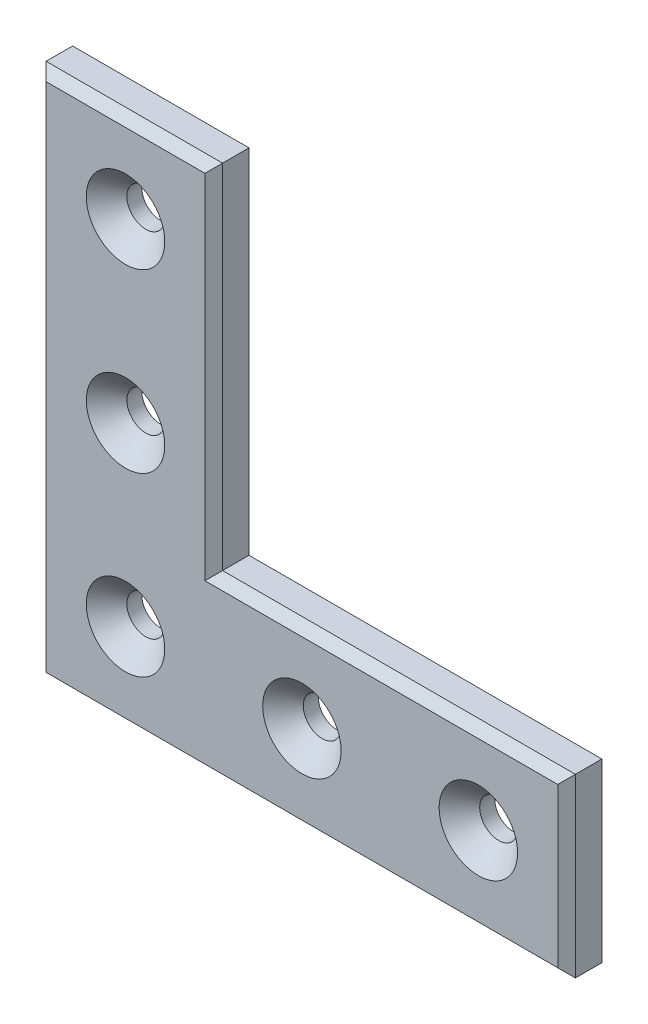
ISO-10303-21;
HEADER;
FILE_DESCRIPTION(('STEP AP214'),'2;1');
FILE_NAME('part.step','',(''),(''),'','','');
FILE_SCHEMA(('AUTOMOTIVE_DESIGN { 1 0 10303 214 1 1 1 1 }'));
ENDSEC;
DATA;
#1=APPLICATION_CONTEXT('core data for automotive mechanical design processes');
#2=APPLICATION_PROTOCOL_DEFINITION('international standard','automotive_design',2000,#1);
#3=PRODUCT_CONTEXT('',#1,'mechanical');
#4=PRODUCT('Part','Part','',(#3));
#5=PRODUCT_RELATED_PRODUCT_CATEGORY('part','',(#4));
#6=PRODUCT_DEFINITION_FORMATION('','',#4);
#7=PRODUCT_DEFINITION_CONTEXT('part definition',#1,'design');
#8=PRODUCT_DEFINITION('design','',#6,#7);
#9=PRODUCT_DEFINITION_SHAPE('','',#8);
#10=(LENGTH_UNIT() NAMED_UNIT(*) SI_UNIT(.MILLI.,.METRE.));
#11=(NAMED_UNIT(*) PLANE_ANGLE_UNIT() SI_UNIT($,.RADIAN.));
#12=(NAMED_UNIT(*) SI_UNIT($,.STERADIAN.) SOLID_ANGLE_UNIT());
#13=UNCERTAINTY_MEASURE_WITH_UNIT(LENGTH_MEASURE(1.E-05),#10,'distance_accuracy_value','');
#14=(GEOMETRIC_REPRESENTATION_CONTEXT(3) GLOBAL_UNCERTAINTY_ASSIGNED_CONTEXT((#13)) GLOBAL_UNIT_ASSIGNED_CONTEXT((#10,
#11,#12)) REPRESENTATION_CONTEXT('',''));
#15=CARTESIAN_POINT('',(0.,0.,0.));
#16=DIRECTION('',(0.,0.,1.));
#17=DIRECTION('',(1.,0.,0.));
#18=AXIS2_PLACEMENT_3D('',#15,#16,#17);
#19=CARTESIAN_POINT('',(0.,0.,4.));
#20=DIRECTION('',(0.,0.,-1.));
#21=DIRECTION('',(-1.,0.,0.));
#22=AXIS2_PLACEMENT_3D('',#19,#20,#21);
#23=PLANE('',#22);
#24=CARTESIAN_POINT('',(20.,0.,4.));
#25=DIRECTION('',(0.,0.,-1.));
#26=DIRECTION('',(-1.,0.,0.));
#27=AXIS2_PLACEMENT_3D('',#24,#25,#26);
#28=CIRCLE('',#27,4.45000000000002);
#29=CARTESIAN_POINT('',(15.55,0.,4.));
#30=VERTEX_POINT('',#29);
#31=EDGE_CURVE('E212',#30,#30,#28,.T.);
#32=ORIENTED_EDGE('',*,*,#31,.T.);
#33=EDGE_LOOP('',(#32));
#34=FACE_BOUND('',#33,.T.);
#35=CARTESIAN_POINT('',(40.,0.,4.));
#36=DIRECTION('',(0.,0.,-1.));
#37=DIRECTION('',(-1.,0.,0.));
#38=AXIS2_PLACEMENT_3D('',#35,#36,#37);
#39=CIRCLE('',#38,4.45000000000002);
#40=CARTESIAN_POINT('',(35.55,0.,4.));
#41=VERTEX_POINT('',#40);
#42=EDGE_CURVE('E209',#41,#41,#39,.T.);
#43=ORIENTED_EDGE('',*,*,#42,.T.);
#44=EDGE_LOOP('',(#43));
#45=FACE_BOUND('',#44,.T.);
#46=CARTESIAN_POINT('',(0.,0.,4.));
#47=DIRECTION('',(0.,0.,-1.));
#48=DIRECTION('',(-1.,0.,0.));
#49=AXIS2_PLACEMENT_3D('',#46,#47,#48);
#50=CIRCLE('',#49,4.45000000000003);
#51=CARTESIAN_POINT('',(-4.45000000000003,0.,4.));
#52=VERTEX_POINT('',#51);
#53=EDGE_CURVE('E206',#52,#52,#50,.T.);
#54=ORIENTED_EDGE('',*,*,#53,.T.);
#55=EDGE_LOOP('',(#54));
#56=FACE_BOUND('',#55,.T.);
#57=CARTESIAN_POINT('',(0.,20.,4.));
#58=DIRECTION('',(0.,0.,-1.));
#59=DIRECTION('',(-1.,0.,0.));
#60=AXIS2_PLACEMENT_3D('',#57,#58,#59);
#61=CIRCLE('',#60,4.45000000000002);
#62=CARTESIAN_POINT('',(-4.45000000000002,20.,4.));
#63=VERTEX_POINT('',#62);
#64=EDGE_CURVE('E203',#63,#63,#61,.T.);
#65=ORIENTED_EDGE('',*,*,#64,.T.);
#66=EDGE_LOOP('',(#65));
#67=FACE_BOUND('',#66,.T.);
#68=CARTESIAN_POINT('',(0.,40.,4.));
#69=DIRECTION('',(0.,0.,-1.));
#70=DIRECTION('',(-1.,0.,0.));
#71=AXIS2_PLACEMENT_3D('',#68,#69,#70);
#72=CIRCLE('',#71,4.45000000000002);
#73=CARTESIAN_POINT('',(-4.45000000000002,40.,4.));
#74=VERTEX_POINT('',#73);
#75=EDGE_CURVE('E200',#74,#74,#72,.T.);
#76=ORIENTED_EDGE('',*,*,#75,.T.);
#77=EDGE_LOOP('',(#76));
#78=FACE_BOUND('',#77,.T.);
#79=DIRECTION('',(1.,0.,0.));
#80=VECTOR('',#79,1.);
#81=CARTESIAN_POINT('',(0.,-9.00000000000001,4.));
#82=LINE('',#81,#80);
#83=CARTESIAN_POINT('',(-9.00000000000001,-9.00000000000001,4.));
#84=VERTEX_POINT('',#83);
#85=CARTESIAN_POINT('',(49.,-9.00000000000001,4.));
#86=VERTEX_POINT('',#85);
#87=EDGE_CURVE('E164',#84,#86,#82,.T.);
#88=ORIENTED_EDGE('',*,*,#87,.T.);
#89=DIRECTION('',(0.,1.,0.));
#90=VECTOR('',#89,1.);
#91=CARTESIAN_POINT('',(49.,0.,4.));
#92=LINE('',#91,#90);
#93=CARTESIAN_POINT('',(49.,9.00000000000001,4.));
#94=VERTEX_POINT('',#93);
#95=EDGE_CURVE('E166',#86,#94,#92,.T.);
#96=ORIENTED_EDGE('',*,*,#95,.T.);
#97=DIRECTION('',(-1.,0.,0.));
#98=VECTOR('',#97,1.);
#99=CARTESIAN_POINT('',(0.,9.00000000000002,4.));
#100=LINE('',#99,#98);
#101=CARTESIAN_POINT('',(9.00000000000002,9.00000000000002,4.));
#102=VERTEX_POINT('',#101);
#103=EDGE_CURVE('E116',#94,#102,#100,.T.);
#104=ORIENTED_EDGE('',*,*,#103,.T.);
#105=DIRECTION('',(0.,1.,0.));
#106=VECTOR('',#105,1.);
#107=CARTESIAN_POINT('',(9.00000000000002,0.,4.));
#108=LINE('',#107,#106);
#109=CARTESIAN_POINT('',(9.00000000000001,49.,4.));
#110=VERTEX_POINT('',#109);
#111=EDGE_CURVE('E158',#102,#110,#108,.T.);
#112=ORIENTED_EDGE('',*,*,#111,.T.);
#113=DIRECTION('',(-1.,0.,0.));
#114=VECTOR('',#113,1.);
#115=CARTESIAN_POINT('',(0.,49.,4.));
#116=LINE('',#115,#114);
#117=CARTESIAN_POINT('',(-9.00000000000001,49.,4.));
#118=VERTEX_POINT('',#117);
#119=EDGE_CURVE('E160',#110,#118,#116,.T.);
#120=ORIENTED_EDGE('',*,*,#119,.T.);
#121=DIRECTION('',(0.,-1.,0.));
#122=VECTOR('',#121,1.);
#123=CARTESIAN_POINT('',(-9.00000000000001,0.,4.));
#124=LINE('',#123,#122);
#125=EDGE_CURVE('E162',#118,#84,#124,.T.);
#126=ORIENTED_EDGE('',*,*,#125,.T.);
#127=EDGE_LOOP('',(#88,#96,#104,#112,#120,#126));
#128=FACE_BOUND('',#127,.T.);
#129=ADVANCED_FACE('F37',(#34,#45,#56,#67,#78,#128),#23,.F.);
#130=CARTESIAN_POINT('',(0.,0.,0.));
#131=DIRECTION('',(0.,0.,-1.));
#132=DIRECTION('',(-1.,0.,0.));
#133=AXIS2_PLACEMENT_3D('',#130,#131,#132);
#134=PLANE('',#133);
#135=CARTESIAN_POINT('',(0.,0.,0.));
#136=DIRECTION('',(0.,0.,1.));
#137=DIRECTION('',(1.,0.,0.));
#138=AXIS2_PLACEMENT_3D('',#135,#136,#137);
#139=CIRCLE('',#138,2.15);
#140=CARTESIAN_POINT('',(2.15,0.,0.));
#141=VERTEX_POINT('',#140);
#142=EDGE_CURVE('E347',#141,#141,#139,.T.);
#143=ORIENTED_EDGE('',*,*,#142,.T.);
#144=EDGE_LOOP('',(#143));
#145=FACE_BOUND('',#144,.T.);
#146=CARTESIAN_POINT('',(0.,20.,0.));
#147=DIRECTION('',(0.,0.,1.));
#148=DIRECTION('',(1.,0.,0.));
#149=AXIS2_PLACEMENT_3D('',#146,#147,#148);
#150=CIRCLE('',#149,2.15);
#151=CARTESIAN_POINT('',(2.15,20.,0.));
#152=VERTEX_POINT('',#151);
#153=EDGE_CURVE('E136',#152,#152,#150,.T.);
#154=ORIENTED_EDGE('',*,*,#153,.T.);
#155=EDGE_LOOP('',(#154));
#156=FACE_BOUND('',#155,.T.);
#157=DIRECTION('',(-1.,0.,0.));
#158=VECTOR('',#157,1.);
#159=CARTESIAN_POINT('',(50.,10.,0.));
#160=LINE('',#159,#158);
#161=CARTESIAN_POINT('',(50.,10.,0.));
#162=VERTEX_POINT('',#161);
#163=CARTESIAN_POINT('',(10.,10.,0.));
#164=VERTEX_POINT('',#163);
#165=EDGE_CURVE('E124',#162,#164,#160,.T.);
#166=ORIENTED_EDGE('',*,*,#165,.F.);
#167=DIRECTION('',(0.,1.,0.));
#168=VECTOR('',#167,1.);
#169=CARTESIAN_POINT('',(50.,-10.,0.));
#170=LINE('',#169,#168);
#171=CARTESIAN_POINT('',(50.,-10.,0.));
#172=VERTEX_POINT('',#171);
#173=EDGE_CURVE('E147',#172,#162,#170,.T.);
#174=ORIENTED_EDGE('',*,*,#173,.F.);
#175=DIRECTION('',(1.,0.,0.));
#176=VECTOR('',#175,1.);
#177=CARTESIAN_POINT('',(-10.,-10.,0.));
#178=LINE('',#177,#176);
#179=CARTESIAN_POINT('',(-10.,-10.,0.));
#180=VERTEX_POINT('',#179);
#181=EDGE_CURVE('E144',#180,#172,#178,.T.);
#182=ORIENTED_EDGE('',*,*,#181,.F.);
#183=DIRECTION('',(0.,-1.,0.));
#184=VECTOR('',#183,1.);
#185=CARTESIAN_POINT('',(-10.,10.,0.));
#186=LINE('',#185,#184);
#187=CARTESIAN_POINT('',(-10.,50.,0.));
#188=VERTEX_POINT('',#187);
#189=EDGE_CURVE('E141',#188,#180,#186,.T.);
#190=ORIENTED_EDGE('',*,*,#189,.F.);
#191=DIRECTION('',(-1.,0.,0.));
#192=VECTOR('',#191,1.);
#193=CARTESIAN_POINT('',(-10.,50.,0.));
#194=LINE('',#193,#192);
#195=CARTESIAN_POINT('',(10.,50.,0.));
#196=VERTEX_POINT('',#195);
#197=EDGE_CURVE('E127',#196,#188,#194,.T.);
#198=ORIENTED_EDGE('',*,*,#197,.F.);
#199=DIRECTION('',(0.,1.,0.));
#200=VECTOR('',#199,1.);
#201=CARTESIAN_POINT('',(10.,10.,0.));
#202=LINE('',#201,#200);
#203=EDGE_CURVE('E111',#164,#196,#202,.T.);
#204=ORIENTED_EDGE('',*,*,#203,.F.);
#205=EDGE_LOOP('',(#166,#174,#182,#190,#198,#204));
#206=FACE_BOUND('',#205,.T.);
#207=CARTESIAN_POINT('',(20.,0.,0.));
#208=DIRECTION('',(0.,0.,1.));
#209=DIRECTION('',(1.,0.,0.));
#210=AXIS2_PLACEMENT_3D('',#207,#208,#209);
#211=CIRCLE('',#210,2.15);
#212=CARTESIAN_POINT('',(22.15,0.,0.));
#213=VERTEX_POINT('',#212);
#214=EDGE_CURVE('E133',#213,#213,#211,.T.);
#215=ORIENTED_EDGE('',*,*,#214,.T.);
#216=EDGE_LOOP('',(#215));
#217=FACE_BOUND('',#216,.T.);
#218=CARTESIAN_POINT('',(0.,40.,0.));
#219=DIRECTION('',(0.,0.,1.));
#220=DIRECTION('',(1.,0.,0.));
#221=AXIS2_PLACEMENT_3D('',#218,#219,#220);
#222=CIRCLE('',#221,2.15);
#223=CARTESIAN_POINT('',(2.15,40.,0.));
#224=VERTEX_POINT('',#223);
#225=EDGE_CURVE('E350',#224,#224,#222,.T.);
#226=ORIENTED_EDGE('',*,*,#225,.T.);
#227=EDGE_LOOP('',(#226));
#228=FACE_BOUND('',#227,.T.);
#229=CARTESIAN_POINT('',(40.,0.,0.));
#230=DIRECTION('',(0.,0.,1.));
#231=DIRECTION('',(1.,0.,0.));
#232=AXIS2_PLACEMENT_3D('',#229,#230,#231);
#233=CIRCLE('',#232,2.15);
#234=CARTESIAN_POINT('',(42.15,0.,0.));
#235=VERTEX_POINT('',#234);
#236=EDGE_CURVE('E197',#235,#235,#233,.T.);
#237=ORIENTED_EDGE('',*,*,#236,.T.);
#238=EDGE_LOOP('',(#237));
#239=FACE_BOUND('',#238,.T.);
#240=ADVANCED_FACE('F121',(#145,#156,#206,#217,#228,#239),#134,.T.);
#241=CARTESIAN_POINT('',(50.,10.,4.));
#242=DIRECTION('',(0.,-1.,0.));
#243=DIRECTION('',(1.,0.,0.));
#244=AXIS2_PLACEMENT_3D('',#241,#242,#243);
#245=PLANE('',#244);
#246=DIRECTION('',(0.,0.,-1.));
#247=VECTOR('',#246,1.);
#248=CARTESIAN_POINT('',(10.,10.,4.));
#249=LINE('',#248,#247);
#250=CARTESIAN_POINT('',(10.,10.,3.00000000000001));
#251=VERTEX_POINT('',#250);
#252=EDGE_CURVE('E108',#251,#164,#249,.T.);
#253=ORIENTED_EDGE('',*,*,#252,.F.);
#254=DIRECTION('',(1.,0.,0.));
#255=VECTOR('',#254,1.);
#256=CARTESIAN_POINT('',(50.,10.,3.00000000000001));
#257=LINE('',#256,#255);
#258=CARTESIAN_POINT('',(50.,10.,3.00000000000001));
#259=VERTEX_POINT('',#258);
#260=EDGE_CURVE('E178',#251,#259,#257,.T.);
#261=ORIENTED_EDGE('',*,*,#260,.T.);
#262=DIRECTION('',(0.,0.,-1.));
#263=VECTOR('',#262,1.);
#264=CARTESIAN_POINT('',(50.,10.,4.));
#265=LINE('',#264,#263);
#266=EDGE_CURVE('E131',#259,#162,#265,.T.);
#267=ORIENTED_EDGE('',*,*,#266,.T.);
#268=ORIENTED_EDGE('',*,*,#165,.T.);
#269=EDGE_LOOP('',(#253,#261,#267,#268));
#270=FACE_BOUND('',#269,.T.);
#271=ADVANCED_FACE('F129',(#270),#245,.F.);
#272=CARTESIAN_POINT('',(10.,10.,4.));
#273=DIRECTION('',(-1.,0.,0.));
#274=DIRECTION('',(0.,-1.,0.));
#275=AXIS2_PLACEMENT_3D('',#272,#273,#274);
#276=PLANE('',#275);
#277=DIRECTION('',(0.,0.,-1.));
#278=VECTOR('',#277,1.);
#279=CARTESIAN_POINT('',(10.,50.,4.));
#280=LINE('',#279,#278);
#281=CARTESIAN_POINT('',(10.,50.,3.00000000000001));
#282=VERTEX_POINT('',#281);
#283=EDGE_CURVE('E117',#282,#196,#280,.T.);
#284=ORIENTED_EDGE('',*,*,#283,.F.);
#285=DIRECTION('',(0.,-1.,0.));
#286=VECTOR('',#285,1.);
#287=CARTESIAN_POINT('',(10.,10.,3.00000000000001));
#288=LINE('',#287,#286);
#289=EDGE_CURVE('E53',#282,#251,#288,.T.);
#290=ORIENTED_EDGE('',*,*,#289,.T.);
#291=ORIENTED_EDGE('',*,*,#252,.T.);
#292=ORIENTED_EDGE('',*,*,#203,.T.);
#293=EDGE_LOOP('',(#284,#290,#291,#292));
#294=FACE_BOUND('',#293,.T.);
#295=ADVANCED_FACE('F110',(#294),#276,.F.);
#296=CARTESIAN_POINT('',(-10.,50.,4.));
#297=DIRECTION('',(0.,-1.,0.));
#298=DIRECTION('',(0.,0.,-1.));
#299=AXIS2_PLACEMENT_3D('',#296,#297,#298);
#300=PLANE('',#299);
#301=DIRECTION('',(0.,0.,-1.));
#302=VECTOR('',#301,1.);
#303=CARTESIAN_POINT('',(-10.,50.,4.));
#304=LINE('',#303,#302);
#305=CARTESIAN_POINT('',(-10.,50.,3.00000000000001));
#306=VERTEX_POINT('',#305);
#307=EDGE_CURVE('E154',#306,#188,#304,.T.);
#308=ORIENTED_EDGE('',*,*,#307,.F.);
#309=DIRECTION('',(1.,0.,0.));
#310=VECTOR('',#309,1.);
#311=CARTESIAN_POINT('',(-10.,50.,3.00000000000001));
#312=LINE('',#311,#310);
#313=EDGE_CURVE('E61',#306,#282,#312,.T.);
#314=ORIENTED_EDGE('',*,*,#313,.T.);
#315=ORIENTED_EDGE('',*,*,#283,.T.);
#316=ORIENTED_EDGE('',*,*,#197,.T.);
#317=EDGE_LOOP('',(#308,#314,#315,#316));
#318=FACE_BOUND('',#317,.T.);
#319=ADVANCED_FACE('F264',(#318),#300,.F.);
#320=CARTESIAN_POINT('',(-10.,10.,4.));
#321=DIRECTION('',(1.,0.,0.));
#322=DIRECTION('',(0.,0.,-1.));
#323=AXIS2_PLACEMENT_3D('',#320,#321,#322);
#324=PLANE('',#323);
#325=DIRECTION('',(0.,0.,-1.));
#326=VECTOR('',#325,1.);
#327=CARTESIAN_POINT('',(-10.,-10.,4.));
#328=LINE('',#327,#326);
#329=CARTESIAN_POINT('',(-10.,-10.,3.00000000000001));
#330=VERTEX_POINT('',#329);
#331=EDGE_CURVE('E152',#330,#180,#328,.T.);
#332=ORIENTED_EDGE('',*,*,#331,.F.);
#333=DIRECTION('',(0.,1.,0.));
#334=VECTOR('',#333,1.);
#335=CARTESIAN_POINT('',(-10.,10.,3.00000000000001));
#336=LINE('',#335,#334);
#337=EDGE_CURVE('E174',#330,#306,#336,.T.);
#338=ORIENTED_EDGE('',*,*,#337,.T.);
#339=ORIENTED_EDGE('',*,*,#307,.T.);
#340=ORIENTED_EDGE('',*,*,#189,.T.);
#341=EDGE_LOOP('',(#332,#338,#339,#340));
#342=FACE_BOUND('',#341,.T.);
#343=ADVANCED_FACE('F260',(#342),#324,.F.);
#344=CARTESIAN_POINT('',(-10.,-10.,4.));
#345=DIRECTION('',(0.,1.,0.));
#346=DIRECTION('',(0.,0.,1.));
#347=AXIS2_PLACEMENT_3D('',#344,#345,#346);
#348=PLANE('',#347);
#349=DIRECTION('',(0.,0.,-1.));
#350=VECTOR('',#349,1.);
#351=CARTESIAN_POINT('',(50.,-10.,4.));
#352=LINE('',#351,#350);
#353=CARTESIAN_POINT('',(50.,-10.,3.00000000000001));
#354=VERTEX_POINT('',#353);
#355=EDGE_CURVE('E150',#354,#172,#352,.T.);
#356=ORIENTED_EDGE('',*,*,#355,.F.);
#357=DIRECTION('',(-1.,0.,0.));
#358=VECTOR('',#357,1.);
#359=CARTESIAN_POINT('',(-10.,-10.,3.00000000000001));
#360=LINE('',#359,#358);
#361=EDGE_CURVE('E172',#354,#330,#360,.T.);
#362=ORIENTED_EDGE('',*,*,#361,.T.);
#363=ORIENTED_EDGE('',*,*,#331,.T.);
#364=ORIENTED_EDGE('',*,*,#181,.T.);
#365=EDGE_LOOP('',(#356,#362,#363,#364));
#366=FACE_BOUND('',#365,.T.);
#367=ADVANCED_FACE('F256',(#366),#348,.F.);
#368=CARTESIAN_POINT('',(50.,-10.,4.));
#369=DIRECTION('',(-1.,0.,0.));
#370=DIRECTION('',(0.,0.,1.));
#371=AXIS2_PLACEMENT_3D('',#368,#369,#370);
#372=PLANE('',#371);
#373=ORIENTED_EDGE('',*,*,#266,.F.);
#374=DIRECTION('',(0.,-1.,0.));
#375=VECTOR('',#374,1.);
#376=CARTESIAN_POINT('',(50.,-10.,3.00000000000001));
#377=LINE('',#376,#375);
#378=EDGE_CURVE('E169',#259,#354,#377,.T.);
#379=ORIENTED_EDGE('',*,*,#378,.T.);
#380=ORIENTED_EDGE('',*,*,#355,.T.);
#381=ORIENTED_EDGE('',*,*,#173,.T.);
#382=EDGE_LOOP('',(#373,#379,#380,#381));
#383=FACE_BOUND('',#382,.T.);
#384=ADVANCED_FACE('F253',(#383),#372,.F.);
#385=CARTESIAN_POINT('',(20.,0.,4.));
#386=DIRECTION('',(0.,0.,-1.));
#387=DIRECTION('',(-1.,0.,0.));
#388=AXIS2_PLACEMENT_3D('',#385,#386,#387);
#389=CYLINDRICAL_SURFACE('',#388,2.15);
#390=CARTESIAN_POINT('',(20.,0.,1.69999999999998));
#391=DIRECTION('',(0.,0.,-1.));
#392=DIRECTION('',(-1.,0.,0.));
#393=AXIS2_PLACEMENT_3D('',#390,#391,#392);
#394=CIRCLE('',#393,2.15);
#395=CARTESIAN_POINT('',(17.85,0.,1.69999999999998));
#396=VERTEX_POINT('',#395);
#397=EDGE_CURVE('E180',#396,#396,#394,.F.);
#398=ORIENTED_EDGE('',*,*,#397,.T.);
#399=EDGE_LOOP('',(#398));
#400=FACE_BOUND('',#399,.T.);
#401=ORIENTED_EDGE('',*,*,#214,.F.);
#402=EDGE_LOOP('',(#401));
#403=FACE_BOUND('',#402,.T.);
#404=ADVANCED_FACE('F250',(#400,#403),#389,.F.);
#405=CARTESIAN_POINT('',(0.,20.,4.));
#406=DIRECTION('',(0.,0.,-1.));
#407=DIRECTION('',(-1.,0.,0.));
#408=AXIS2_PLACEMENT_3D('',#405,#406,#407);
#409=CYLINDRICAL_SURFACE('',#408,2.15);
#410=CARTESIAN_POINT('',(0.,20.,1.69999999999998));
#411=DIRECTION('',(0.,0.,-1.));
#412=DIRECTION('',(-1.,0.,0.));
#413=AXIS2_PLACEMENT_3D('',#410,#411,#412);
#414=CIRCLE('',#413,2.15);
#415=CARTESIAN_POINT('',(-2.15,20.,1.69999999999998));
#416=VERTEX_POINT('',#415);
#417=EDGE_CURVE('E46',#416,#416,#414,.F.);
#418=ORIENTED_EDGE('',*,*,#417,.T.);
#419=EDGE_LOOP('',(#418));
#420=FACE_BOUND('',#419,.T.);
#421=ORIENTED_EDGE('',*,*,#153,.F.);
#422=EDGE_LOOP('',(#421));
#423=FACE_BOUND('',#422,.T.);
#424=ADVANCED_FACE('F223',(#420,#423),#409,.F.);
#425=CARTESIAN_POINT('',(0.,40.,4.));
#426=DIRECTION('',(0.,0.,-1.));
#427=DIRECTION('',(-1.,0.,0.));
#428=AXIS2_PLACEMENT_3D('',#425,#426,#427);
#429=CYLINDRICAL_SURFACE('',#428,2.15);
#430=CARTESIAN_POINT('',(0.,40.,1.69999999999998));
#431=DIRECTION('',(0.,0.,-1.));
#432=DIRECTION('',(-1.,0.,0.));
#433=AXIS2_PLACEMENT_3D('',#430,#431,#432);
#434=CIRCLE('',#433,2.15);
#435=CARTESIAN_POINT('',(-2.15,40.,1.69999999999998));
#436=VERTEX_POINT('',#435);
#437=EDGE_CURVE('E11',#436,#436,#434,.F.);
#438=ORIENTED_EDGE('',*,*,#437,.T.);
#439=EDGE_LOOP('',(#438));
#440=FACE_BOUND('',#439,.T.);
#441=ORIENTED_EDGE('',*,*,#225,.F.);
#442=EDGE_LOOP('',(#441));
#443=FACE_BOUND('',#442,.T.);
#444=ADVANCED_FACE('F358',(#440,#443),#429,.F.);
#445=CARTESIAN_POINT('',(0.,0.,4.));
#446=DIRECTION('',(0.,0.,-1.));
#447=DIRECTION('',(-1.,0.,0.));
#448=AXIS2_PLACEMENT_3D('',#445,#446,#447);
#449=CYLINDRICAL_SURFACE('',#448,2.15);
#450=CARTESIAN_POINT('',(0.,0.,1.69999999999998));
#451=DIRECTION('',(0.,0.,-1.));
#452=DIRECTION('',(-1.,0.,0.));
#453=AXIS2_PLACEMENT_3D('',#450,#451,#452);
#454=CIRCLE('',#453,2.15);
#455=CARTESIAN_POINT('',(-2.15,0.,1.69999999999998));
#456=VERTEX_POINT('',#455);
#457=EDGE_CURVE('E218',#456,#456,#454,.F.);
#458=ORIENTED_EDGE('',*,*,#457,.T.);
#459=EDGE_LOOP('',(#458));
#460=FACE_BOUND('',#459,.T.);
#461=ORIENTED_EDGE('',*,*,#142,.F.);
#462=EDGE_LOOP('',(#461));
#463=FACE_BOUND('',#462,.T.);
#464=ADVANCED_FACE('F342',(#460,#463),#449,.F.);
#465=CARTESIAN_POINT('',(40.,0.,4.));
#466=DIRECTION('',(0.,0.,-1.));
#467=DIRECTION('',(-1.,0.,0.));
#468=AXIS2_PLACEMENT_3D('',#465,#466,#467);
#469=CYLINDRICAL_SURFACE('',#468,2.15);
#470=CARTESIAN_POINT('',(40.,0.,1.69999999999998));
#471=DIRECTION('',(0.,0.,-1.));
#472=DIRECTION('',(-1.,0.,0.));
#473=AXIS2_PLACEMENT_3D('',#470,#471,#472);
#474=CIRCLE('',#473,2.15);
#475=CARTESIAN_POINT('',(37.85,0.,1.69999999999998));
#476=VERTEX_POINT('',#475);
#477=EDGE_CURVE('E215',#476,#476,#474,.F.);
#478=ORIENTED_EDGE('',*,*,#477,.T.);
#479=EDGE_LOOP('',(#478));
#480=FACE_BOUND('',#479,.T.);
#481=ORIENTED_EDGE('',*,*,#236,.F.);
#482=EDGE_LOOP('',(#481));
#483=FACE_BOUND('',#482,.T.);
#484=ADVANCED_FACE('F315',(#480,#483),#469,.F.);
#485=CARTESIAN_POINT('',(0.,49.,4.));
#486=DIRECTION('',(0.,-0.70710678118655,-0.707106781186545));
#487=DIRECTION('',(-1.,0.,0.));
#488=AXIS2_PLACEMENT_3D('',#485,#486,#487);
#489=PLANE('',#488);
#490=DIRECTION('',(-0.577350269189624,-0.577350269189625,0.577350269189629));
#491=VECTOR('',#490,1.);
#492=CARTESIAN_POINT('',(-7.33333333333325,32.6666666666668,20.3333333333334));
#493=LINE('',#492,#491);
#494=EDGE_CURVE('E191',#282,#110,#493,.T.);
#495=ORIENTED_EDGE('',*,*,#494,.F.);
#496=ORIENTED_EDGE('',*,*,#313,.F.);
#497=DIRECTION('',(0.577350269189625,-0.577350269189625,0.577350269189629));
#498=VECTOR('',#497,1.);
#499=CARTESIAN_POINT('',(-6.00000000000002,46.,7.00000000000001));
#500=LINE('',#499,#498);
#501=EDGE_CURVE('E194',#118,#306,#500,.F.);
#502=ORIENTED_EDGE('',*,*,#501,.F.);
#503=ORIENTED_EDGE('',*,*,#119,.F.);
#504=EDGE_LOOP('',(#495,#496,#502,#503));
#505=FACE_BOUND('',#504,.T.);
#506=ADVANCED_FACE('F309',(#505),#489,.F.);
#507=CARTESIAN_POINT('',(-9.00000000000001,0.,4.));
#508=DIRECTION('',(0.70710678118655,0.,-0.707106781186545));
#509=DIRECTION('',(0.,-1.,0.));
#510=AXIS2_PLACEMENT_3D('',#507,#508,#509);
#511=PLANE('',#510);
#512=ORIENTED_EDGE('',*,*,#501,.T.);
#513=ORIENTED_EDGE('',*,*,#337,.F.);
#514=DIRECTION('',(0.577350269189625,0.577350269189625,0.577350269189629));
#515=VECTOR('',#514,1.);
#516=CARTESIAN_POINT('',(-6.00000000000002,-6.00000000000002,7.00000000000001));
#517=LINE('',#516,#515);
#518=EDGE_CURVE('E188',#84,#330,#517,.F.);
#519=ORIENTED_EDGE('',*,*,#518,.F.);
#520=ORIENTED_EDGE('',*,*,#125,.F.);
#521=EDGE_LOOP('',(#512,#513,#519,#520));
#522=FACE_BOUND('',#521,.T.);
#523=ADVANCED_FACE('F302',(#522),#511,.F.);
#524=CARTESIAN_POINT('',(9.00000000000002,0.,4.));
#525=DIRECTION('',(-0.70710678118655,0.,-0.707106781186545));
#526=DIRECTION('',(0.,1.,0.));
#527=AXIS2_PLACEMENT_3D('',#524,#525,#526);
#528=PLANE('',#527);
#529=ORIENTED_EDGE('',*,*,#494,.T.);
#530=ORIENTED_EDGE('',*,*,#111,.F.);
#531=DIRECTION('',(-0.577350269189625,-0.577350269189624,0.577350269189629));
#532=VECTOR('',#531,1.);
#533=CARTESIAN_POINT('',(6.00000000000003,6.00000000000003,7.00000000000001));
#534=LINE('',#533,#532);
#535=EDGE_CURVE('E185',#251,#102,#534,.T.);
#536=ORIENTED_EDGE('',*,*,#535,.F.);
#537=ORIENTED_EDGE('',*,*,#289,.F.);
#538=EDGE_LOOP('',(#529,#530,#536,#537));
#539=FACE_BOUND('',#538,.T.);
#540=ADVANCED_FACE('F295',(#539),#528,.F.);
#541=CARTESIAN_POINT('',(0.,-9.00000000000001,4.));
#542=DIRECTION('',(0.,0.70710678118655,-0.707106781186545));
#543=DIRECTION('',(1.,0.,0.));
#544=AXIS2_PLACEMENT_3D('',#541,#542,#543);
#545=PLANE('',#544);
#546=ORIENTED_EDGE('',*,*,#518,.T.);
#547=ORIENTED_EDGE('',*,*,#361,.F.);
#548=DIRECTION('',(-0.577350269189625,0.577350269189625,0.577350269189629));
#549=VECTOR('',#548,1.);
#550=CARTESIAN_POINT('',(32.6666666666668,7.33333333333325,20.3333333333334));
#551=LINE('',#550,#549);
#552=EDGE_CURVE('E183',#86,#354,#551,.F.);
#553=ORIENTED_EDGE('',*,*,#552,.F.);
#554=ORIENTED_EDGE('',*,*,#87,.F.);
#555=EDGE_LOOP('',(#546,#547,#553,#554));
#556=FACE_BOUND('',#555,.T.);
#557=ADVANCED_FACE('F288',(#556),#545,.F.);
#558=CARTESIAN_POINT('',(0.,9.00000000000002,4.));
#559=DIRECTION('',(0.,-0.70710678118655,-0.707106781186545));
#560=DIRECTION('',(-1.,0.,0.));
#561=AXIS2_PLACEMENT_3D('',#558,#559,#560);
#562=PLANE('',#561);
#563=ORIENTED_EDGE('',*,*,#535,.T.);
#564=ORIENTED_EDGE('',*,*,#103,.F.);
#565=DIRECTION('',(0.577350269189625,0.577350269189624,-0.577350269189629));
#566=VECTOR('',#565,1.);
#567=CARTESIAN_POINT('',(32.6666666666667,-7.33333333333324,20.3333333333334));
#568=LINE('',#567,#566);
#569=EDGE_CURVE('E181',#259,#94,#568,.F.);
#570=ORIENTED_EDGE('',*,*,#569,.F.);
#571=ORIENTED_EDGE('',*,*,#260,.F.);
#572=EDGE_LOOP('',(#563,#564,#570,#571));
#573=FACE_BOUND('',#572,.T.);
#574=ADVANCED_FACE('F281',(#573),#562,.F.);
#575=CARTESIAN_POINT('',(49.,0.,4.));
#576=DIRECTION('',(-0.70710678118655,0.,-0.707106781186545));
#577=DIRECTION('',(0.,1.,0.));
#578=AXIS2_PLACEMENT_3D('',#575,#576,#577);
#579=PLANE('',#578);
#580=ORIENTED_EDGE('',*,*,#552,.T.);
#581=ORIENTED_EDGE('',*,*,#378,.F.);
#582=ORIENTED_EDGE('',*,*,#569,.T.);
#583=ORIENTED_EDGE('',*,*,#95,.F.);
#584=EDGE_LOOP('',(#580,#581,#582,#583));
#585=FACE_BOUND('',#584,.T.);
#586=ADVANCED_FACE('F273',(#585),#579,.F.);
#587=CARTESIAN_POINT('',(20.,0.,1.69999999999998));
#588=DIRECTION('',(0.,0.,1.));
#589=DIRECTION('',(1.,0.,0.));
#590=AXIS2_PLACEMENT_3D('',#587,#588,#589);
#591=CONICAL_SURFACE('',#590,2.15,0.785398163397449);
#592=ORIENTED_EDGE('',*,*,#31,.F.);
#593=EDGE_LOOP('',(#592));
#594=FACE_BOUND('',#593,.T.);
#595=ORIENTED_EDGE('',*,*,#397,.F.);
#596=EDGE_LOOP('',(#595));
#597=FACE_BOUND('',#596,.T.);
#598=ADVANCED_FACE('F280',(#594,#597),#591,.F.);
#599=CARTESIAN_POINT('',(40.,0.,1.69999999999998));
#600=DIRECTION('',(0.,0.,1.));
#601=DIRECTION('',(1.,0.,0.));
#602=AXIS2_PLACEMENT_3D('',#599,#600,#601);
#603=CONICAL_SURFACE('',#602,2.15,0.78539816339745);
#604=ORIENTED_EDGE('',*,*,#42,.F.);
#605=EDGE_LOOP('',(#604));
#606=FACE_BOUND('',#605,.T.);
#607=ORIENTED_EDGE('',*,*,#477,.F.);
#608=EDGE_LOOP('',(#607));
#609=FACE_BOUND('',#608,.T.);
#610=ADVANCED_FACE('F235',(#606,#609),#603,.F.);
#611=CARTESIAN_POINT('',(0.,0.,1.69999999999998));
#612=DIRECTION('',(0.,0.,1.));
#613=DIRECTION('',(1.,0.,0.));
#614=AXIS2_PLACEMENT_3D('',#611,#612,#613);
#615=CONICAL_SURFACE('',#614,2.15,0.78539816339745);
#616=ORIENTED_EDGE('',*,*,#53,.F.);
#617=EDGE_LOOP('',(#616));
#618=FACE_BOUND('',#617,.T.);
#619=ORIENTED_EDGE('',*,*,#457,.F.);
#620=EDGE_LOOP('',(#619));
#621=FACE_BOUND('',#620,.T.);
#622=ADVANCED_FACE('F228',(#618,#621),#615,.F.);
#623=CARTESIAN_POINT('',(0.,20.,1.69999999999998));
#624=DIRECTION('',(0.,0.,1.));
#625=DIRECTION('',(1.,0.,0.));
#626=AXIS2_PLACEMENT_3D('',#623,#624,#625);
#627=CONICAL_SURFACE('',#626,2.15,0.78539816339745);
#628=ORIENTED_EDGE('',*,*,#64,.F.);
#629=EDGE_LOOP('',(#628));
#630=FACE_BOUND('',#629,.T.);
#631=ORIENTED_EDGE('',*,*,#417,.F.);
#632=EDGE_LOOP('',(#631));
#633=FACE_BOUND('',#632,.T.);
#634=ADVANCED_FACE('F226',(#630,#633),#627,.F.);
#635=CARTESIAN_POINT('',(0.,40.,1.69999999999998));
#636=DIRECTION('',(0.,0.,1.));
#637=DIRECTION('',(1.,0.,0.));
#638=AXIS2_PLACEMENT_3D('',#635,#636,#637);
#639=CONICAL_SURFACE('',#638,2.15,0.78539816339745);
#640=ORIENTED_EDGE('',*,*,#75,.F.);
#641=EDGE_LOOP('',(#640));
#642=FACE_BOUND('',#641,.T.);
#643=ORIENTED_EDGE('',*,*,#437,.F.);
#644=EDGE_LOOP('',(#643));
#645=FACE_BOUND('',#644,.T.);
#646=ADVANCED_FACE('F40',(#642,#645),#639,.F.);
#647=CLOSED_SHELL('',(#129,#240,#271,#295,#319,#343,#367,#384,#404,#424,#444,#464,#484,#506,
#523,#540,#557,#574,#586,#598,#610,#622,#634,#646));
#648=MANIFOLD_SOLID_BREP('B2',#647);
#649=ADVANCED_BREP_SHAPE_REPRESENTATION('',(#18,#648),#14);
#650=SHAPE_DEFINITION_REPRESENTATION(#9,#649);
ENDSEC;
END-ISO-10303-21;
